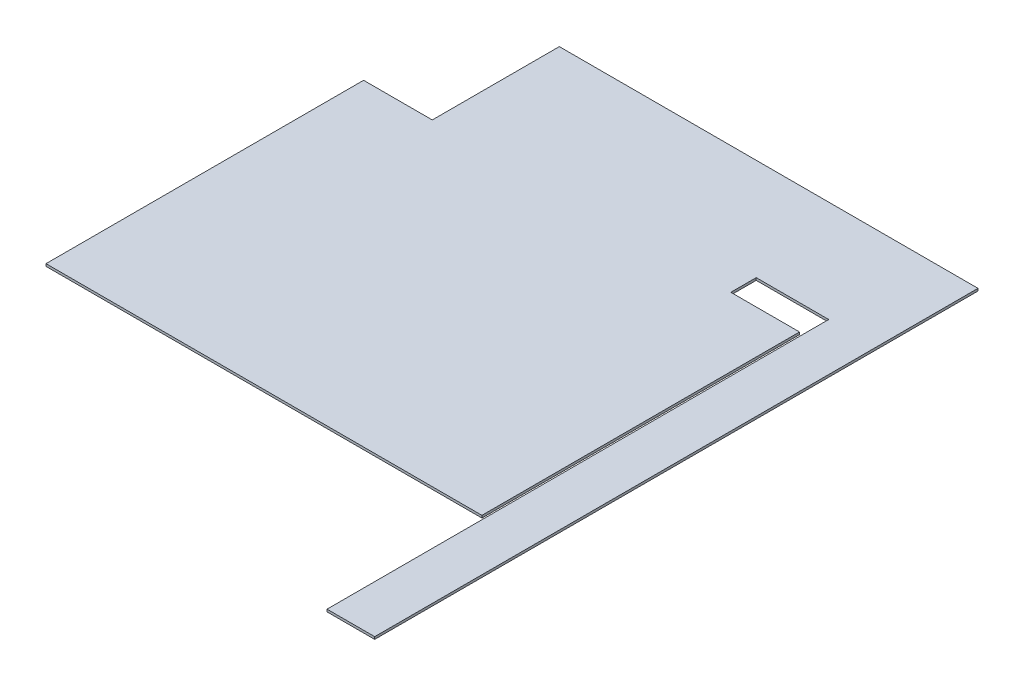
ISO-10303-21;
HEADER;
FILE_DESCRIPTION(('STEP AP214'),'2;1');
FILE_NAME('part.step','',(''),(''),'','','');
FILE_SCHEMA(('AUTOMOTIVE_DESIGN { 1 0 10303 214 1 1 1 1 }'));
ENDSEC;
DATA;
#1=APPLICATION_CONTEXT('core data for automotive mechanical design processes');
#2=APPLICATION_PROTOCOL_DEFINITION('international standard','automotive_design',2000,#1);
#3=PRODUCT_CONTEXT('',#1,'mechanical');
#4=PRODUCT('Part','Part','',(#3));
#5=PRODUCT_RELATED_PRODUCT_CATEGORY('part','',(#4));
#6=PRODUCT_DEFINITION_FORMATION('','',#4);
#7=PRODUCT_DEFINITION_CONTEXT('part definition',#1,'design');
#8=PRODUCT_DEFINITION('design','',#6,#7);
#9=PRODUCT_DEFINITION_SHAPE('','',#8);
#10=(LENGTH_UNIT() NAMED_UNIT(*) SI_UNIT(.MILLI.,.METRE.));
#11=(NAMED_UNIT(*) PLANE_ANGLE_UNIT() SI_UNIT($,.RADIAN.));
#12=(NAMED_UNIT(*) SI_UNIT($,.STERADIAN.) SOLID_ANGLE_UNIT());
#13=UNCERTAINTY_MEASURE_WITH_UNIT(LENGTH_MEASURE(1.E-05),#10,'distance_accuracy_value','');
#14=(GEOMETRIC_REPRESENTATION_CONTEXT(3) GLOBAL_UNCERTAINTY_ASSIGNED_CONTEXT((#13)) GLOBAL_UNIT_ASSIGNED_CONTEXT((#10,
#11,#12)) REPRESENTATION_CONTEXT('',''));
#15=CARTESIAN_POINT('',(0.,0.,0.));
#16=DIRECTION('',(0.,0.,1.));
#17=DIRECTION('',(1.,0.,0.));
#18=AXIS2_PLACEMENT_3D('',#15,#16,#17);
#19=CARTESIAN_POINT('',(4.88301987048943,0.,3.2));
#20=DIRECTION('',(0.,0.,1.));
#21=DIRECTION('',(0.,1.,0.));
#22=AXIS2_PLACEMENT_3D('',#19,#20,#21);
#23=PLANE('',#22);
#24=DIRECTION('',(-1.5707700731103E-12,-1.,0.));
#25=VECTOR('',#24,1.);
#26=CARTESIAN_POINT('',(6.98301987048943,0.,3.2));
#27=LINE('',#26,#25);
#28=CARTESIAN_POINT('',(6.98301987048937,0.,3.2));
#29=VERTEX_POINT('',#28);
#30=CARTESIAN_POINT('',(6.98301987048943,-0.0749999999999874,3.2));
#31=VERTEX_POINT('',#30);
#32=EDGE_CURVE('E13',#29,#31,#27,.T.);
#33=ORIENTED_EDGE('',*,*,#32,.F.);
#34=DIRECTION('',(-1.,0.,0.));
#35=VECTOR('',#34,1.);
#36=CARTESIAN_POINT('',(4.88301987048943,0.,3.2));
#37=LINE('',#36,#35);
#38=CARTESIAN_POINT('',(4.7,0.,3.2));
#39=VERTEX_POINT('',#38);
#40=EDGE_CURVE('E146',#29,#39,#37,.T.);
#41=ORIENTED_EDGE('',*,*,#40,.T.);
#42=DIRECTION('',(0.,1.,0.));
#43=VECTOR('',#42,1.);
#44=CARTESIAN_POINT('',(4.7,-0.0749999999999997,3.2));
#45=LINE('',#44,#43);
#46=CARTESIAN_POINT('',(4.7,-0.0750000000000001,3.2));
#47=VERTEX_POINT('',#46);
#48=EDGE_CURVE('E242',#47,#39,#45,.T.);
#49=ORIENTED_EDGE('',*,*,#48,.F.);
#50=DIRECTION('',(1.,0.,0.));
#51=VECTOR('',#50,1.);
#52=CARTESIAN_POINT('',(4.80801987048942,-0.0750000000000021,3.2));
#53=LINE('',#52,#51);
#54=EDGE_CURVE('E227',#31,#47,#53,.F.);
#55=ORIENTED_EDGE('',*,*,#54,.F.);
#56=EDGE_LOOP('',(#33,#41,#49,#55));
#57=FACE_BOUND('',#56,.T.);
#58=ADVANCED_FACE('F129',(#57),#23,.T.);
#59=CARTESIAN_POINT('',(8.48301987048943,0.,0.));
#60=DIRECTION('',(0.,0.,-1.));
#61=DIRECTION('',(-1.,0.,0.));
#62=AXIS2_PLACEMENT_3D('',#59,#60,#61);
#63=PLANE('',#62);
#64=DIRECTION('',(-1.,0.,0.));
#65=VECTOR('',#64,1.);
#66=CARTESIAN_POINT('',(4.80801987048942,-0.075000000000003,0.));
#67=LINE('',#66,#65);
#68=CARTESIAN_POINT('',(-4.7,-0.075,0.));
#69=VERTEX_POINT('',#68);
#70=CARTESIAN_POINT('',(8.48301987048943,-0.0749999999999779,0.));
#71=VERTEX_POINT('',#70);
#72=EDGE_CURVE('E232',#69,#71,#67,.F.);
#73=ORIENTED_EDGE('',*,*,#72,.F.);
#74=DIRECTION('',(0.,1.,0.));
#75=VECTOR('',#74,1.);
#76=CARTESIAN_POINT('',(-4.7,-0.075,0.));
#77=LINE('',#76,#75);
#78=CARTESIAN_POINT('',(-4.7,0.,0.));
#79=VERTEX_POINT('',#78);
#80=EDGE_CURVE('E230',#69,#79,#77,.T.);
#81=ORIENTED_EDGE('',*,*,#80,.T.);
#82=DIRECTION('',(1.,0.,0.));
#83=VECTOR('',#82,1.);
#84=CARTESIAN_POINT('',(8.48301987048943,0.,0.));
#85=LINE('',#84,#83);
#86=CARTESIAN_POINT('',(8.48301987048943,0.,0.));
#87=VERTEX_POINT('',#86);
#88=EDGE_CURVE('E155',#79,#87,#85,.T.);
#89=ORIENTED_EDGE('',*,*,#88,.T.);
#90=DIRECTION('',(0.,-1.,0.));
#91=VECTOR('',#90,1.);
#92=CARTESIAN_POINT('',(8.48301987048943,0.,0.));
#93=LINE('',#92,#91);
#94=EDGE_CURVE('E138',#87,#71,#93,.T.);
#95=ORIENTED_EDGE('',*,*,#94,.T.);
#96=EDGE_LOOP('',(#73,#81,#89,#95));
#97=FACE_BOUND('',#96,.T.);
#98=ADVANCED_FACE('F231',(#97),#63,.T.);
#99=CARTESIAN_POINT('',(4.80801987048942,0.,0.));
#100=DIRECTION('',(0.,1.,0.));
#101=DIRECTION('',(-1.,0.,0.));
#102=AXIS2_PLACEMENT_3D('',#99,#100,#101);
#103=PLANE('',#102);
#104=ORIENTED_EDGE('',*,*,#88,.F.);
#105=DIRECTION('',(0.,0.,1.));
#106=VECTOR('',#105,1.);
#107=CARTESIAN_POINT('',(-4.7,0.,0.));
#108=LINE('',#107,#106);
#109=CARTESIAN_POINT('',(-4.7,0.,4.));
#110=VERTEX_POINT('',#109);
#111=EDGE_CURVE('E223',#79,#110,#108,.T.);
#112=ORIENTED_EDGE('',*,*,#111,.T.);
#113=DIRECTION('',(1.,0.,0.));
#114=VECTOR('',#113,1.);
#115=CARTESIAN_POINT('',(-4.88301987048943,0.,4.));
#116=LINE('',#115,#114);
#117=CARTESIAN_POINT('',(-6.8629236810571,0.,4.));
#118=VERTEX_POINT('',#117);
#119=EDGE_CURVE('E278',#118,#110,#116,.T.);
#120=ORIENTED_EDGE('',*,*,#119,.F.);
#121=DIRECTION('',(0.,0.,-1.));
#122=VECTOR('',#121,1.);
#123=CARTESIAN_POINT('',(-6.8629236810571,0.,4.));
#124=LINE('',#123,#122);
#125=CARTESIAN_POINT('',(-6.8629236810571,0.,14.));
#126=VERTEX_POINT('',#125);
#127=EDGE_CURVE('E293',#126,#118,#124,.T.);
#128=ORIENTED_EDGE('',*,*,#127,.F.);
#129=DIRECTION('',(-1.,0.,0.));
#130=VECTOR('',#129,1.);
#131=CARTESIAN_POINT('',(-6.8629236810571,0.,14.));
#132=LINE('',#131,#130);
#133=CARTESIAN_POINT('',(6.8629236810571,0.,14.));
#134=VERTEX_POINT('',#133);
#135=EDGE_CURVE('E289',#134,#126,#132,.T.);
#136=ORIENTED_EDGE('',*,*,#135,.F.);
#137=DIRECTION('',(0.,0.,1.));
#138=VECTOR('',#137,1.);
#139=CARTESIAN_POINT('',(6.8629236810571,0.,14.));
#140=LINE('',#139,#138);
#141=CARTESIAN_POINT('',(6.8629236810571,0.,4.));
#142=VERTEX_POINT('',#141);
#143=EDGE_CURVE('E283',#142,#134,#140,.T.);
#144=ORIENTED_EDGE('',*,*,#143,.F.);
#145=DIRECTION('',(1.,0.,0.));
#146=VECTOR('',#145,1.);
#147=CARTESIAN_POINT('',(6.8629236810571,0.,4.));
#148=LINE('',#147,#146);
#149=CARTESIAN_POINT('',(4.7,0.,4.));
#150=VERTEX_POINT('',#149);
#151=EDGE_CURVE('E276',#150,#142,#148,.T.);
#152=ORIENTED_EDGE('',*,*,#151,.F.);
#153=DIRECTION('',(0.,0.,-1.));
#154=VECTOR('',#153,1.);
#155=CARTESIAN_POINT('',(4.7,0.,0.));
#156=LINE('',#155,#154);
#157=EDGE_CURVE('E237',#150,#39,#156,.T.);
#158=ORIENTED_EDGE('',*,*,#157,.T.);
#159=ORIENTED_EDGE('',*,*,#40,.F.);
#160=DIRECTION('',(0.,0.,1.));
#161=VECTOR('',#160,1.);
#162=CARTESIAN_POINT('',(6.98301987048943,0.,3.20093811447295));
#163=LINE('',#162,#161);
#164=CARTESIAN_POINT('',(6.98301987048943,0.,18.9967869314589));
#165=VERTEX_POINT('',#164);
#166=EDGE_CURVE('E299',#165,#29,#163,.F.);
#167=ORIENTED_EDGE('',*,*,#166,.F.);
#168=DIRECTION('',(-1.,0.,0.));
#169=VECTOR('',#168,1.);
#170=CARTESIAN_POINT('',(7.73301987048943,0.,18.9967869314589));
#171=LINE('',#170,#169);
#172=CARTESIAN_POINT('',(8.48301987048943,0.,18.9967869314589));
#173=VERTEX_POINT('',#172);
#174=EDGE_CURVE('E303',#173,#165,#171,.T.);
#175=ORIENTED_EDGE('',*,*,#174,.F.);
#176=DIRECTION('',(0.,0.,1.));
#177=VECTOR('',#176,1.);
#178=CARTESIAN_POINT('',(8.48301987048943,0.,3.2));
#179=LINE('',#178,#177);
#180=EDGE_CURVE('E226',#87,#173,#179,.T.);
#181=ORIENTED_EDGE('',*,*,#180,.F.);
#182=EDGE_LOOP('',(#104,#112,#120,#128,#136,#144,#152,#158,#159,#167,#175,#181));
#183=FACE_BOUND('',#182,.T.);
#184=ADVANCED_FACE('F220',(#183),#103,.T.);
#185=CARTESIAN_POINT('',(0.,-0.075,0.));
#186=DIRECTION('',(0.,1.,0.));
#187=DIRECTION('',(0.,0.,1.));
#188=AXIS2_PLACEMENT_3D('',#185,#186,#187);
#189=PLANE('',#188);
#190=ORIENTED_EDGE('',*,*,#54,.T.);
#191=DIRECTION('',(0.,0.,-1.));
#192=VECTOR('',#191,1.);
#193=CARTESIAN_POINT('',(4.7,-0.075,0.));
#194=LINE('',#193,#192);
#195=CARTESIAN_POINT('',(4.7,-0.075,4.));
#196=VERTEX_POINT('',#195);
#197=EDGE_CURVE('E246',#196,#47,#194,.T.);
#198=ORIENTED_EDGE('',*,*,#197,.F.);
#199=DIRECTION('',(-1.,0.,0.));
#200=VECTOR('',#199,1.);
#201=CARTESIAN_POINT('',(4.80801987048942,-0.0750000000000039,4.));
#202=LINE('',#201,#200);
#203=CARTESIAN_POINT('',(6.8629236810571,-0.07499999999999,4.));
#204=VERTEX_POINT('',#203);
#205=EDGE_CURVE('E266',#196,#204,#202,.F.);
#206=ORIENTED_EDGE('',*,*,#205,.T.);
#207=DIRECTION('',(0.,0.,-1.));
#208=VECTOR('',#207,1.);
#209=CARTESIAN_POINT('',(6.8629236810571,-0.07499999999999,0.));
#210=LINE('',#209,#208);
#211=CARTESIAN_POINT('',(6.8629236810571,-0.07499999999999,14.));
#212=VERTEX_POINT('',#211);
#213=EDGE_CURVE('E261',#204,#212,#210,.F.);
#214=ORIENTED_EDGE('',*,*,#213,.T.);
#215=DIRECTION('',(1.,0.,0.));
#216=VECTOR('',#215,1.);
#217=CARTESIAN_POINT('',(-4.80801987048942,-0.075000000000003,14.));
#218=LINE('',#217,#216);
#219=CARTESIAN_POINT('',(-6.8629236810571,-0.0749999999999891,14.));
#220=VERTEX_POINT('',#219);
#221=EDGE_CURVE('E271',#212,#220,#218,.F.);
#222=ORIENTED_EDGE('',*,*,#221,.T.);
#223=DIRECTION('',(0.,0.,1.));
#224=VECTOR('',#223,1.);
#225=CARTESIAN_POINT('',(-6.8629236810571,-0.0749999999999848,0.));
#226=LINE('',#225,#224);
#227=CARTESIAN_POINT('',(-6.8629236810571,-0.0749999999999857,4.));
#228=VERTEX_POINT('',#227);
#229=EDGE_CURVE('E268',#220,#228,#226,.F.);
#230=ORIENTED_EDGE('',*,*,#229,.T.);
#231=DIRECTION('',(-1.,0.,0.));
#232=VECTOR('',#231,1.);
#233=CARTESIAN_POINT('',(-4.80801987048942,-0.0749999999999995,4.));
#234=LINE('',#233,#232);
#235=CARTESIAN_POINT('',(-4.7,-0.0749999999999993,4.));
#236=VERTEX_POINT('',#235);
#237=EDGE_CURVE('E133',#228,#236,#234,.F.);
#238=ORIENTED_EDGE('',*,*,#237,.T.);
#239=DIRECTION('',(0.,0.,1.));
#240=VECTOR('',#239,1.);
#241=CARTESIAN_POINT('',(-4.7,-0.075,0.));
#242=LINE('',#241,#240);
#243=EDGE_CURVE('E256',#69,#236,#242,.T.);
#244=ORIENTED_EDGE('',*,*,#243,.F.);
#245=ORIENTED_EDGE('',*,*,#72,.T.);
#246=DIRECTION('',(0.,0.,-1.));
#247=VECTOR('',#246,1.);
#248=CARTESIAN_POINT('',(8.48301987048943,-0.0749999999999779,0.));
#249=LINE('',#248,#247);
#250=CARTESIAN_POINT('',(8.48301987048943,-0.0750000000000559,18.9967869314589));
#251=VERTEX_POINT('',#250);
#252=EDGE_CURVE('E313',#71,#251,#249,.F.);
#253=ORIENTED_EDGE('',*,*,#252,.T.);
#254=DIRECTION('',(-1.,0.,0.));
#255=VECTOR('',#254,1.);
#256=CARTESIAN_POINT('',(7.73301987048943,-0.0750000000000611,18.9967869314589));
#257=LINE('',#256,#255);
#258=CARTESIAN_POINT('',(6.98301987048943,-0.0750000000000663,18.9967869314589));
#259=VERTEX_POINT('',#258);
#260=EDGE_CURVE('E296',#251,#259,#257,.T.);
#261=ORIENTED_EDGE('',*,*,#260,.T.);
#262=DIRECTION('',(0.,0.,1.));
#263=VECTOR('',#262,1.);
#264=CARTESIAN_POINT('',(6.98301987048943,-0.0749999999999874,3.20093811447295));
#265=LINE('',#264,#263);
#266=EDGE_CURVE('E310',#259,#31,#265,.F.);
#267=ORIENTED_EDGE('',*,*,#266,.T.);
#268=EDGE_LOOP('',(#190,#198,#206,#214,#222,#230,#238,#244,#245,#253,#261,#267));
#269=FACE_BOUND('',#268,.T.);
#270=ADVANCED_FACE('F131',(#269),#189,.F.);
#271=CARTESIAN_POINT('',(8.48301987048943,0.,3.2));
#272=DIRECTION('',(1.,0.,0.));
#273=DIRECTION('',(0.,1.,0.));
#274=AXIS2_PLACEMENT_3D('',#271,#272,#273);
#275=PLANE('',#274);
#276=ORIENTED_EDGE('',*,*,#252,.F.);
#277=ORIENTED_EDGE('',*,*,#94,.F.);
#278=ORIENTED_EDGE('',*,*,#180,.T.);
#279=DIRECTION('',(0.,1.,0.));
#280=VECTOR('',#279,1.);
#281=CARTESIAN_POINT('',(8.48301987048943,0.,18.9967869314589));
#282=LINE('',#281,#280);
#283=EDGE_CURVE('E236',#251,#173,#282,.T.);
#284=ORIENTED_EDGE('',*,*,#283,.F.);
#285=EDGE_LOOP('',(#276,#277,#278,#284));
#286=FACE_BOUND('',#285,.T.);
#287=ADVANCED_FACE('F331',(#286),#275,.T.);
#288=CARTESIAN_POINT('',(6.98301987048943,-0.0674999999999877,3.20093811447295));
#289=DIRECTION('',(1.,0.,0.));
#290=DIRECTION('',(0.,0.,1.));
#291=AXIS2_PLACEMENT_3D('',#288,#289,#290);
#292=PLANE('',#291);
#293=ORIENTED_EDGE('',*,*,#166,.T.);
#294=ORIENTED_EDGE('',*,*,#32,.T.);
#295=ORIENTED_EDGE('',*,*,#266,.F.);
#296=DIRECTION('',(0.,1.,0.));
#297=VECTOR('',#296,1.);
#298=CARTESIAN_POINT('',(6.98301987048943,0.,18.9967869314589));
#299=LINE('',#298,#297);
#300=EDGE_CURVE('E300',#259,#165,#299,.T.);
#301=ORIENTED_EDGE('',*,*,#300,.T.);
#302=EDGE_LOOP('',(#293,#294,#295,#301));
#303=FACE_BOUND('',#302,.T.);
#304=ADVANCED_FACE('F325',(#303),#292,.F.);
#305=CARTESIAN_POINT('',(7.73301987048943,0.,18.9967869314589));
#306=DIRECTION('',(0.,0.,-1.));
#307=DIRECTION('',(-1.,0.,0.));
#308=AXIS2_PLACEMENT_3D('',#305,#306,#307);
#309=PLANE('',#308);
#310=ORIENTED_EDGE('',*,*,#300,.F.);
#311=ORIENTED_EDGE('',*,*,#260,.F.);
#312=ORIENTED_EDGE('',*,*,#283,.T.);
#313=ORIENTED_EDGE('',*,*,#174,.T.);
#314=EDGE_LOOP('',(#310,#311,#312,#313));
#315=FACE_BOUND('',#314,.T.);
#316=ADVANCED_FACE('F327',(#315),#309,.F.);
#317=CARTESIAN_POINT('',(-6.8629236810571,0.,4.));
#318=DIRECTION('',(-1.,0.,0.));
#319=DIRECTION('',(0.,-1.,0.));
#320=AXIS2_PLACEMENT_3D('',#317,#318,#319);
#321=PLANE('',#320);
#322=ORIENTED_EDGE('',*,*,#229,.F.);
#323=DIRECTION('',(0.,-1.,0.));
#324=VECTOR('',#323,1.);
#325=CARTESIAN_POINT('',(-6.8629236810571,0.,14.));
#326=LINE('',#325,#324);
#327=EDGE_CURVE('E286',#126,#220,#326,.T.);
#328=ORIENTED_EDGE('',*,*,#327,.F.);
#329=ORIENTED_EDGE('',*,*,#127,.T.);
#330=DIRECTION('',(0.,-1.,0.));
#331=VECTOR('',#330,1.);
#332=CARTESIAN_POINT('',(-6.8629236810571,0.,4.));
#333=LINE('',#332,#331);
#334=EDGE_CURVE('E291',#118,#228,#333,.T.);
#335=ORIENTED_EDGE('',*,*,#334,.T.);
#336=EDGE_LOOP('',(#322,#328,#329,#335));
#337=FACE_BOUND('',#336,.T.);
#338=ADVANCED_FACE('F341',(#337),#321,.T.);
#339=CARTESIAN_POINT('',(-6.8629236810571,0.,14.));
#340=DIRECTION('',(0.,0.,1.));
#341=DIRECTION('',(0.,-1.,0.));
#342=AXIS2_PLACEMENT_3D('',#339,#340,#341);
#343=PLANE('',#342);
#344=ORIENTED_EDGE('',*,*,#221,.F.);
#345=DIRECTION('',(0.,-1.,0.));
#346=VECTOR('',#345,1.);
#347=CARTESIAN_POINT('',(6.8629236810571,0.,14.));
#348=LINE('',#347,#346);
#349=EDGE_CURVE('E280',#134,#212,#348,.T.);
#350=ORIENTED_EDGE('',*,*,#349,.F.);
#351=ORIENTED_EDGE('',*,*,#135,.T.);
#352=ORIENTED_EDGE('',*,*,#327,.T.);
#353=EDGE_LOOP('',(#344,#350,#351,#352));
#354=FACE_BOUND('',#353,.T.);
#355=ADVANCED_FACE('F343',(#354),#343,.T.);
#356=CARTESIAN_POINT('',(6.8629236810571,0.,14.));
#357=DIRECTION('',(1.,0.,0.));
#358=DIRECTION('',(0.,1.,0.));
#359=AXIS2_PLACEMENT_3D('',#356,#357,#358);
#360=PLANE('',#359);
#361=ORIENTED_EDGE('',*,*,#213,.F.);
#362=DIRECTION('',(0.,-1.,0.));
#363=VECTOR('',#362,1.);
#364=CARTESIAN_POINT('',(6.8629236810571,0.,4.));
#365=LINE('',#364,#363);
#366=EDGE_CURVE('E273',#142,#204,#365,.T.);
#367=ORIENTED_EDGE('',*,*,#366,.F.);
#368=ORIENTED_EDGE('',*,*,#143,.T.);
#369=ORIENTED_EDGE('',*,*,#349,.T.);
#370=EDGE_LOOP('',(#361,#367,#368,#369));
#371=FACE_BOUND('',#370,.T.);
#372=ADVANCED_FACE('F347',(#371),#360,.T.);
#373=CARTESIAN_POINT('',(-4.88301987048943,0.,4.));
#374=DIRECTION('',(0.,0.,-1.));
#375=DIRECTION('',(0.,1.,0.));
#376=AXIS2_PLACEMENT_3D('',#373,#374,#375);
#377=PLANE('',#376);
#378=ORIENTED_EDGE('',*,*,#119,.T.);
#379=DIRECTION('',(0.,1.,0.));
#380=VECTOR('',#379,1.);
#381=CARTESIAN_POINT('',(-4.7,-0.0749999999999979,4.));
#382=LINE('',#381,#380);
#383=EDGE_CURVE('E241',#236,#110,#382,.T.);
#384=ORIENTED_EDGE('',*,*,#383,.F.);
#385=ORIENTED_EDGE('',*,*,#237,.F.);
#386=ORIENTED_EDGE('',*,*,#334,.F.);
#387=EDGE_LOOP('',(#378,#384,#385,#386));
#388=FACE_BOUND('',#387,.T.);
#389=ADVANCED_FACE('F335',(#388),#377,.T.);
#390=CARTESIAN_POINT('',(6.8629236810571,0.,4.));
#391=DIRECTION('',(0.,0.,-1.));
#392=DIRECTION('',(0.,-1.,0.));
#393=AXIS2_PLACEMENT_3D('',#390,#391,#392);
#394=PLANE('',#393);
#395=ORIENTED_EDGE('',*,*,#205,.F.);
#396=DIRECTION('',(0.,1.,0.));
#397=VECTOR('',#396,1.);
#398=CARTESIAN_POINT('',(4.7,-0.074999999999998,4.));
#399=LINE('',#398,#397);
#400=EDGE_CURVE('E258',#196,#150,#399,.T.);
#401=ORIENTED_EDGE('',*,*,#400,.T.);
#402=ORIENTED_EDGE('',*,*,#151,.T.);
#403=ORIENTED_EDGE('',*,*,#366,.T.);
#404=EDGE_LOOP('',(#395,#401,#402,#403));
#405=FACE_BOUND('',#404,.T.);
#406=ADVANCED_FACE('F351',(#405),#394,.T.);
#407=CARTESIAN_POINT('',(-4.7,-0.075,0.));
#408=DIRECTION('',(-1.,0.,0.));
#409=DIRECTION('',(0.,0.,1.));
#410=AXIS2_PLACEMENT_3D('',#407,#408,#409);
#411=PLANE('',#410);
#412=ORIENTED_EDGE('',*,*,#243,.T.);
#413=ORIENTED_EDGE('',*,*,#383,.T.);
#414=ORIENTED_EDGE('',*,*,#111,.F.);
#415=ORIENTED_EDGE('',*,*,#80,.F.);
#416=EDGE_LOOP('',(#412,#413,#414,#415));
#417=FACE_BOUND('',#416,.T.);
#418=ADVANCED_FACE('F239',(#417),#411,.T.);
#419=CARTESIAN_POINT('',(4.7,-0.075,0.));
#420=DIRECTION('',(1.,0.,0.));
#421=DIRECTION('',(0.,0.,-1.));
#422=AXIS2_PLACEMENT_3D('',#419,#420,#421);
#423=PLANE('',#422);
#424=ORIENTED_EDGE('',*,*,#400,.F.);
#425=ORIENTED_EDGE('',*,*,#197,.T.);
#426=ORIENTED_EDGE('',*,*,#48,.T.);
#427=ORIENTED_EDGE('',*,*,#157,.F.);
#428=EDGE_LOOP('',(#424,#425,#426,#427));
#429=FACE_BOUND('',#428,.T.);
#430=ADVANCED_FACE('F353',(#429),#423,.T.);
#431=CLOSED_SHELL('',(#58,#98,#184,#270,#287,#304,#316,#338,#355,#372,#389,#406,#418,#430));
#432=MANIFOLD_SOLID_BREP('B2',#431);
#433=ADVANCED_BREP_SHAPE_REPRESENTATION('',(#18,#432),#14);
#434=SHAPE_DEFINITION_REPRESENTATION(#9,#433);
ENDSEC;
END-ISO-10303-21;
